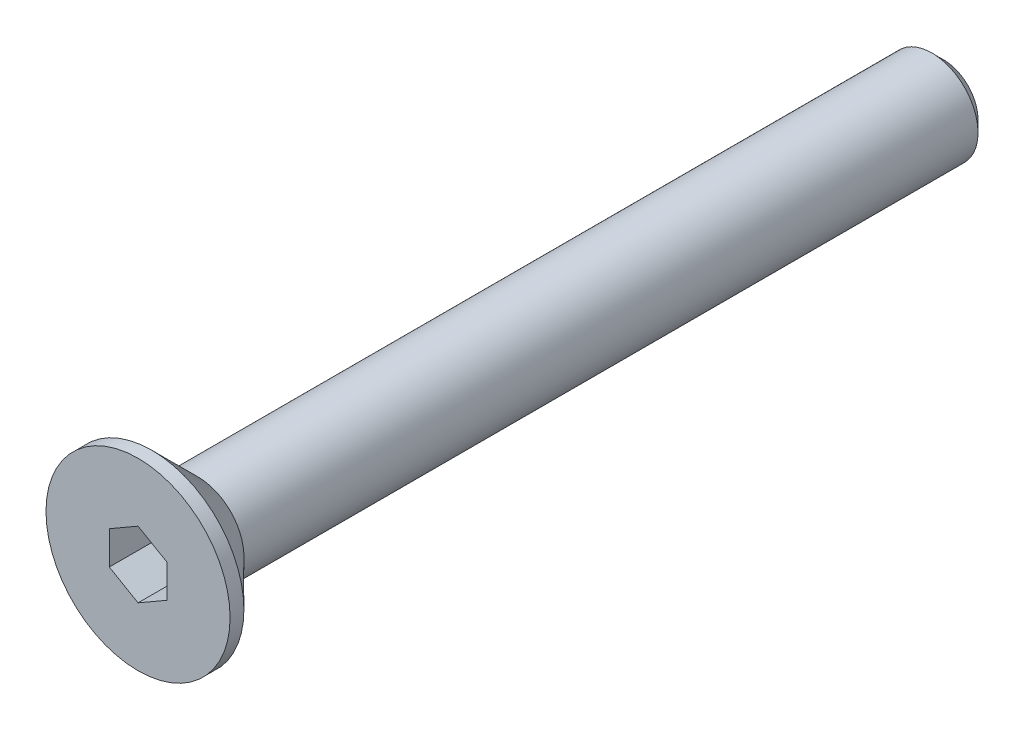
ISO-10303-21;
HEADER;
FILE_DESCRIPTION(('STEP AP214'),'2;1');
FILE_NAME('part.step','',(''),(''),'','','');
FILE_SCHEMA(('AUTOMOTIVE_DESIGN { 1 0 10303 214 1 1 1 1 }'));
ENDSEC;
DATA;
#1=APPLICATION_CONTEXT('core data for automotive mechanical design processes');
#2=APPLICATION_PROTOCOL_DEFINITION('international standard','automotive_design',2000,#1);
#3=PRODUCT_CONTEXT('',#1,'mechanical');
#4=PRODUCT('Part','Part','',(#3));
#5=PRODUCT_RELATED_PRODUCT_CATEGORY('part','',(#4));
#6=PRODUCT_DEFINITION_FORMATION('','',#4);
#7=PRODUCT_DEFINITION_CONTEXT('part definition',#1,'design');
#8=PRODUCT_DEFINITION('design','',#6,#7);
#9=PRODUCT_DEFINITION_SHAPE('','',#8);
#10=(LENGTH_UNIT() NAMED_UNIT(*) SI_UNIT(.MILLI.,.METRE.));
#11=(NAMED_UNIT(*) PLANE_ANGLE_UNIT() SI_UNIT($,.RADIAN.));
#12=(NAMED_UNIT(*) SI_UNIT($,.STERADIAN.) SOLID_ANGLE_UNIT());
#13=UNCERTAINTY_MEASURE_WITH_UNIT(LENGTH_MEASURE(1.E-05),#10,'distance_accuracy_value','');
#14=(GEOMETRIC_REPRESENTATION_CONTEXT(3) GLOBAL_UNCERTAINTY_ASSIGNED_CONTEXT((#13)) GLOBAL_UNIT_ASSIGNED_CONTEXT((#10,
#11,#12)) REPRESENTATION_CONTEXT('',''));
#15=CARTESIAN_POINT('',(0.,0.,0.));
#16=DIRECTION('',(0.,0.,1.));
#17=DIRECTION('',(1.,0.,0.));
#18=AXIS2_PLACEMENT_3D('',#15,#16,#17);
#19=CARTESIAN_POINT('',(0.,0.,17.5));
#20=DIRECTION('',(0.,0.,1.));
#21=DIRECTION('',(1.,0.,0.));
#22=AXIS2_PLACEMENT_3D('',#19,#20,#21);
#23=PLANE('',#22);
#24=DIRECTION('',(-0.866025403784439,0.5,0.));
#25=VECTOR('',#24,1.);
#26=CARTESIAN_POINT('',(1.25,0.721687836487034,17.5));
#27=LINE('',#26,#25);
#28=CARTESIAN_POINT('',(1.25,0.721687836487034,17.5));
#29=VERTEX_POINT('',#28);
#30=CARTESIAN_POINT('',(0.,1.44337567297407,17.5));
#31=VERTEX_POINT('',#30);
#32=EDGE_CURVE('E53',#29,#31,#27,.T.);
#33=ORIENTED_EDGE('',*,*,#32,.F.);
#34=DIRECTION('',(0.,1.,0.));
#35=VECTOR('',#34,1.);
#36=CARTESIAN_POINT('',(1.25,-0.721687836487031,17.5));
#37=LINE('',#36,#35);
#38=CARTESIAN_POINT('',(1.25,-0.721687836487031,17.5));
#39=VERTEX_POINT('',#38);
#40=EDGE_CURVE('E136',#39,#29,#37,.T.);
#41=ORIENTED_EDGE('',*,*,#40,.F.);
#42=DIRECTION('',(0.866025403784439,0.5,0.));
#43=VECTOR('',#42,1.);
#44=CARTESIAN_POINT('',(0.,-1.44337567297406,17.5));
#45=LINE('',#44,#43);
#46=CARTESIAN_POINT('',(0.,-1.44337567297406,17.5));
#47=VERTEX_POINT('',#46);
#48=EDGE_CURVE('E134',#47,#39,#45,.T.);
#49=ORIENTED_EDGE('',*,*,#48,.F.);
#50=DIRECTION('',(0.866025403784439,-0.5,0.));
#51=VECTOR('',#50,1.);
#52=CARTESIAN_POINT('',(-1.25,-0.721687836487031,17.5));
#53=LINE('',#52,#51);
#54=CARTESIAN_POINT('',(-1.25,-0.721687836487031,17.5));
#55=VERTEX_POINT('',#54);
#56=EDGE_CURVE('E101',#55,#47,#53,.T.);
#57=ORIENTED_EDGE('',*,*,#56,.F.);
#58=DIRECTION('',(0.,-1.,0.));
#59=VECTOR('',#58,1.);
#60=CARTESIAN_POINT('',(-1.25,0.721687836487034,17.5));
#61=LINE('',#60,#59);
#62=CARTESIAN_POINT('',(-1.25,0.721687836487034,17.5));
#63=VERTEX_POINT('',#62);
#64=EDGE_CURVE('E130',#63,#55,#61,.T.);
#65=ORIENTED_EDGE('',*,*,#64,.F.);
#66=DIRECTION('',(-0.866025403784439,-0.5,0.));
#67=VECTOR('',#66,1.);
#68=CARTESIAN_POINT('',(0.,1.44337567297407,17.5));
#69=LINE('',#68,#67);
#70=EDGE_CURVE('E127',#31,#63,#69,.T.);
#71=ORIENTED_EDGE('',*,*,#70,.F.);
#72=EDGE_LOOP('',(#33,#41,#49,#57,#65,#71));
#73=FACE_BOUND('',#72,.T.);
#74=CARTESIAN_POINT('',(0.,0.,17.5));
#75=DIRECTION('',(0.,0.,-1.));
#76=DIRECTION('',(-1.,0.,0.));
#77=AXIS2_PLACEMENT_3D('',#74,#75,#76);
#78=CIRCLE('',#77,4.);
#79=CARTESIAN_POINT('',(-4.,0.,17.5));
#80=VERTEX_POINT('',#79);
#81=EDGE_CURVE('E151',#80,#80,#78,.T.);
#82=ORIENTED_EDGE('',*,*,#81,.F.);
#83=EDGE_LOOP('',(#82));
#84=FACE_BOUND('',#83,.T.);
#85=ADVANCED_FACE('F37',(#73,#84),#23,.T.);
#86=CARTESIAN_POINT('',(0.,0.,-17.5));
#87=DIRECTION('',(0.,0.,-1.));
#88=DIRECTION('',(-1.,0.,0.));
#89=AXIS2_PLACEMENT_3D('',#86,#87,#88);
#90=CYLINDRICAL_SURFACE('',#89,4.);
#91=ORIENTED_EDGE('',*,*,#81,.T.);
#92=EDGE_LOOP('',(#91));
#93=FACE_BOUND('',#92,.T.);
#94=CARTESIAN_POINT('',(0.,0.,16.9));
#95=DIRECTION('',(0.,0.,-1.));
#96=DIRECTION('',(-1.,0.,0.));
#97=AXIS2_PLACEMENT_3D('',#94,#95,#96);
#98=CIRCLE('',#97,4.);
#99=CARTESIAN_POINT('',(-4.,0.,16.9));
#100=VERTEX_POINT('',#99);
#101=EDGE_CURVE('E148',#100,#100,#98,.T.);
#102=ORIENTED_EDGE('',*,*,#101,.F.);
#103=EDGE_LOOP('',(#102));
#104=FACE_BOUND('',#103,.T.);
#105=ADVANCED_FACE('F171',(#93,#104),#90,.T.);
#106=CARTESIAN_POINT('',(0.,0.,14.9));
#107=DIRECTION('',(0.,0.,1.));
#108=DIRECTION('',(1.,0.,0.));
#109=AXIS2_PLACEMENT_3D('',#106,#107,#108);
#110=CONICAL_SURFACE('',#109,2.,0.78539816339745);
#111=ORIENTED_EDGE('',*,*,#101,.T.);
#112=EDGE_LOOP('',(#111));
#113=FACE_BOUND('',#112,.T.);
#114=CARTESIAN_POINT('',(0.,0.,14.9));
#115=DIRECTION('',(0.,0.,-1.));
#116=DIRECTION('',(-1.,0.,0.));
#117=AXIS2_PLACEMENT_3D('',#114,#115,#116);
#118=CIRCLE('',#117,2.);
#119=CARTESIAN_POINT('',(-2.,0.,14.9));
#120=VERTEX_POINT('',#119);
#121=EDGE_CURVE('E140',#120,#120,#118,.T.);
#122=ORIENTED_EDGE('',*,*,#121,.F.);
#123=EDGE_LOOP('',(#122));
#124=FACE_BOUND('',#123,.T.);
#125=ADVANCED_FACE('F176',(#113,#124),#110,.T.);
#126=CARTESIAN_POINT('',(0.,0.,-17.5));
#127=DIRECTION('',(0.,0.,-1.));
#128=DIRECTION('',(-1.,0.,0.));
#129=AXIS2_PLACEMENT_3D('',#126,#127,#128);
#130=CYLINDRICAL_SURFACE('',#129,2.);
#131=CARTESIAN_POINT('',(0.,0.,-17.));
#132=DIRECTION('',(0.,0.,-1.));
#133=DIRECTION('',(-1.,0.,0.));
#134=AXIS2_PLACEMENT_3D('',#131,#132,#133);
#135=CIRCLE('',#134,2.);
#136=CARTESIAN_POINT('',(-2.,0.,-17.));
#137=VERTEX_POINT('',#136);
#138=EDGE_CURVE('E11',#137,#137,#135,.F.);
#139=ORIENTED_EDGE('',*,*,#138,.T.);
#140=EDGE_LOOP('',(#139));
#141=FACE_BOUND('',#140,.T.);
#142=ORIENTED_EDGE('',*,*,#121,.T.);
#143=EDGE_LOOP('',(#142));
#144=FACE_BOUND('',#143,.T.);
#145=ADVANCED_FACE('F167',(#141,#144),#130,.T.);
#146=CARTESIAN_POINT('',(0.,2.,-17.5));
#147=DIRECTION('',(0.,0.,-1.));
#148=DIRECTION('',(-1.,0.,0.));
#149=AXIS2_PLACEMENT_3D('',#146,#147,#148);
#150=PLANE('',#149);
#151=CARTESIAN_POINT('',(0.,0.,-17.5));
#152=DIRECTION('',(0.,0.,-1.));
#153=DIRECTION('',(-1.,0.,0.));
#154=AXIS2_PLACEMENT_3D('',#151,#152,#153);
#155=CIRCLE('',#154,1.49999999999999);
#156=CARTESIAN_POINT('',(-1.49999999999999,0.,-17.5));
#157=VERTEX_POINT('',#156);
#158=EDGE_CURVE('E46',#157,#157,#155,.T.);
#159=ORIENTED_EDGE('',*,*,#158,.T.);
#160=EDGE_LOOP('',(#159));
#161=FACE_BOUND('',#160,.T.);
#162=ADVANCED_FACE('F156',(#161),#150,.T.);
#163=CARTESIAN_POINT('',(0.,0.,-17.5));
#164=DIRECTION('',(0.,0.,1.));
#165=DIRECTION('',(1.,0.,0.));
#166=AXIS2_PLACEMENT_3D('',#163,#164,#165);
#167=CONICAL_SURFACE('',#166,1.49999999999999,0.785398163397448);
#168=ORIENTED_EDGE('',*,*,#138,.F.);
#169=EDGE_LOOP('',(#168));
#170=FACE_BOUND('',#169,.T.);
#171=ORIENTED_EDGE('',*,*,#158,.F.);
#172=EDGE_LOOP('',(#171));
#173=FACE_BOUND('',#172,.T.);
#174=ADVANCED_FACE('F40',(#170,#173),#167,.T.);
#175=CARTESIAN_POINT('',(1.25,0.721687836487034,15.));
#176=DIRECTION('',(0.5,0.866025403784439,0.));
#177=DIRECTION('',(-0.866025403784439,0.5,0.));
#178=AXIS2_PLACEMENT_3D('',#175,#176,#177);
#179=PLANE('',#178);
#180=ORIENTED_EDGE('',*,*,#32,.T.);
#181=DIRECTION('',(0.,0.,1.));
#182=VECTOR('',#181,1.);
#183=CARTESIAN_POINT('',(0.,1.44337567297407,15.));
#184=LINE('',#183,#182);
#185=CARTESIAN_POINT('',(0.,1.44337567297407,15.));
#186=VERTEX_POINT('',#185);
#187=EDGE_CURVE('E83',#186,#31,#184,.T.);
#188=ORIENTED_EDGE('',*,*,#187,.F.);
#189=DIRECTION('',(-0.866025403784439,0.5,0.));
#190=VECTOR('',#189,1.);
#191=CARTESIAN_POINT('',(1.25,0.721687836487034,15.));
#192=LINE('',#191,#190);
#193=CARTESIAN_POINT('',(1.25,0.721687836487034,15.));
#194=VERTEX_POINT('',#193);
#195=EDGE_CURVE('E138',#194,#186,#192,.T.);
#196=ORIENTED_EDGE('',*,*,#195,.F.);
#197=DIRECTION('',(0.,0.,1.));
#198=VECTOR('',#197,1.);
#199=CARTESIAN_POINT('',(1.25,0.721687836487034,15.));
#200=LINE('',#199,#198);
#201=EDGE_CURVE('E61',#194,#29,#200,.T.);
#202=ORIENTED_EDGE('',*,*,#201,.T.);
#203=EDGE_LOOP('',(#180,#188,#196,#202));
#204=FACE_BOUND('',#203,.T.);
#205=ADVANCED_FACE('F159',(#204),#179,.F.);
#206=CARTESIAN_POINT('',(1.25,-0.721687836487031,15.));
#207=DIRECTION('',(1.,0.,0.));
#208=DIRECTION('',(0.,1.,0.));
#209=AXIS2_PLACEMENT_3D('',#206,#207,#208);
#210=PLANE('',#209);
#211=ORIENTED_EDGE('',*,*,#40,.T.);
#212=ORIENTED_EDGE('',*,*,#201,.F.);
#213=DIRECTION('',(0.,1.,0.));
#214=VECTOR('',#213,1.);
#215=CARTESIAN_POINT('',(1.25,-0.721687836487031,15.));
#216=LINE('',#215,#214);
#217=CARTESIAN_POINT('',(1.25,-0.721687836487031,15.));
#218=VERTEX_POINT('',#217);
#219=EDGE_CURVE('E113',#218,#194,#216,.T.);
#220=ORIENTED_EDGE('',*,*,#219,.F.);
#221=DIRECTION('',(0.,0.,1.));
#222=VECTOR('',#221,1.);
#223=CARTESIAN_POINT('',(1.25,-0.721687836487031,15.));
#224=LINE('',#223,#222);
#225=EDGE_CURVE('E105',#218,#39,#224,.T.);
#226=ORIENTED_EDGE('',*,*,#225,.T.);
#227=EDGE_LOOP('',(#211,#212,#220,#226));
#228=FACE_BOUND('',#227,.T.);
#229=ADVANCED_FACE('F165',(#228),#210,.F.);
#230=CARTESIAN_POINT('',(0.,-1.44337567297406,15.));
#231=DIRECTION('',(0.5,-0.866025403784439,0.));
#232=DIRECTION('',(0.866025403784439,0.5,0.));
#233=AXIS2_PLACEMENT_3D('',#230,#231,#232);
#234=PLANE('',#233);
#235=ORIENTED_EDGE('',*,*,#48,.T.);
#236=ORIENTED_EDGE('',*,*,#225,.F.);
#237=DIRECTION('',(0.866025403784439,0.5,0.));
#238=VECTOR('',#237,1.);
#239=CARTESIAN_POINT('',(0.,-1.44337567297406,15.));
#240=LINE('',#239,#238);
#241=CARTESIAN_POINT('',(0.,-1.44337567297406,15.));
#242=VERTEX_POINT('',#241);
#243=EDGE_CURVE('E109',#242,#218,#240,.T.);
#244=ORIENTED_EDGE('',*,*,#243,.F.);
#245=DIRECTION('',(0.,0.,1.));
#246=VECTOR('',#245,1.);
#247=CARTESIAN_POINT('',(0.,-1.44337567297406,15.));
#248=LINE('',#247,#246);
#249=EDGE_CURVE('E94',#242,#47,#248,.T.);
#250=ORIENTED_EDGE('',*,*,#249,.T.);
#251=EDGE_LOOP('',(#235,#236,#244,#250));
#252=FACE_BOUND('',#251,.T.);
#253=ADVANCED_FACE('F110',(#252),#234,.F.);
#254=CARTESIAN_POINT('',(-1.25,-0.721687836487031,15.));
#255=DIRECTION('',(-0.5,-0.866025403784438,0.));
#256=DIRECTION('',(0.866025403784439,-0.5,0.));
#257=AXIS2_PLACEMENT_3D('',#254,#255,#256);
#258=PLANE('',#257);
#259=ORIENTED_EDGE('',*,*,#56,.T.);
#260=ORIENTED_EDGE('',*,*,#249,.F.);
#261=DIRECTION('',(0.866025403784439,-0.5,0.));
#262=VECTOR('',#261,1.);
#263=CARTESIAN_POINT('',(-1.25,-0.721687836487031,15.));
#264=LINE('',#263,#262);
#265=CARTESIAN_POINT('',(-1.25,-0.721687836487031,15.));
#266=VERTEX_POINT('',#265);
#267=EDGE_CURVE('E98',#266,#242,#264,.T.);
#268=ORIENTED_EDGE('',*,*,#267,.F.);
#269=DIRECTION('',(0.,0.,1.));
#270=VECTOR('',#269,1.);
#271=CARTESIAN_POINT('',(-1.25,-0.721687836487031,15.));
#272=LINE('',#271,#270);
#273=EDGE_CURVE('E106',#266,#55,#272,.T.);
#274=ORIENTED_EDGE('',*,*,#273,.T.);
#275=EDGE_LOOP('',(#259,#260,#268,#274));
#276=FACE_BOUND('',#275,.T.);
#277=ADVANCED_FACE('F96',(#276),#258,.F.);
#278=CARTESIAN_POINT('',(-1.25,0.721687836487034,15.));
#279=DIRECTION('',(-1.,0.,0.));
#280=DIRECTION('',(0.,0.,1.));
#281=AXIS2_PLACEMENT_3D('',#278,#279,#280);
#282=PLANE('',#281);
#283=ORIENTED_EDGE('',*,*,#64,.T.);
#284=ORIENTED_EDGE('',*,*,#273,.F.);
#285=DIRECTION('',(0.,-1.,0.));
#286=VECTOR('',#285,1.);
#287=CARTESIAN_POINT('',(-1.25,0.721687836487034,15.));
#288=LINE('',#287,#286);
#289=CARTESIAN_POINT('',(-1.25,0.721687836487034,15.));
#290=VERTEX_POINT('',#289);
#291=EDGE_CURVE('E119',#290,#266,#288,.T.);
#292=ORIENTED_EDGE('',*,*,#291,.F.);
#293=DIRECTION('',(0.,0.,1.));
#294=VECTOR('',#293,1.);
#295=CARTESIAN_POINT('',(-1.25,0.721687836487034,15.));
#296=LINE('',#295,#294);
#297=EDGE_CURVE('E143',#290,#63,#296,.T.);
#298=ORIENTED_EDGE('',*,*,#297,.T.);
#299=EDGE_LOOP('',(#283,#284,#292,#298));
#300=FACE_BOUND('',#299,.T.);
#301=ADVANCED_FACE('F190',(#300),#282,.F.);
#302=CARTESIAN_POINT('',(0.,1.44337567297407,15.));
#303=DIRECTION('',(-0.5,0.866025403784439,0.));
#304=DIRECTION('',(-0.866025403784439,-0.5,0.));
#305=AXIS2_PLACEMENT_3D('',#302,#303,#304);
#306=PLANE('',#305);
#307=ORIENTED_EDGE('',*,*,#70,.T.);
#308=ORIENTED_EDGE('',*,*,#297,.F.);
#309=DIRECTION('',(-0.866025403784439,-0.5,0.));
#310=VECTOR('',#309,1.);
#311=CARTESIAN_POINT('',(0.,1.44337567297407,15.));
#312=LINE('',#311,#310);
#313=EDGE_CURVE('E121',#186,#290,#312,.T.);
#314=ORIENTED_EDGE('',*,*,#313,.F.);
#315=ORIENTED_EDGE('',*,*,#187,.T.);
#316=EDGE_LOOP('',(#307,#308,#314,#315));
#317=FACE_BOUND('',#316,.T.);
#318=ADVANCED_FACE('F187',(#317),#306,.F.);
#319=CARTESIAN_POINT('',(0.,0.,15.));
#320=DIRECTION('',(0.,0.,1.));
#321=DIRECTION('',(1.,0.,0.));
#322=AXIS2_PLACEMENT_3D('',#319,#320,#321);
#323=PLANE('',#322);
#324=ORIENTED_EDGE('',*,*,#195,.T.);
#325=ORIENTED_EDGE('',*,*,#313,.T.);
#326=ORIENTED_EDGE('',*,*,#291,.T.);
#327=ORIENTED_EDGE('',*,*,#267,.T.);
#328=ORIENTED_EDGE('',*,*,#243,.T.);
#329=ORIENTED_EDGE('',*,*,#219,.T.);
#330=EDGE_LOOP('',(#324,#325,#326,#327,#328,#329));
#331=FACE_BOUND('',#330,.T.);
#332=ADVANCED_FACE('F116',(#331),#323,.T.);
#333=CLOSED_SHELL('',(#85,#105,#125,#145,#162,#174,#205,#229,#253,#277,#301,#318,#332));
#334=MANIFOLD_SOLID_BREP('B2',#333);
#335=ADVANCED_BREP_SHAPE_REPRESENTATION('',(#18,#334),#14);
#336=SHAPE_DEFINITION_REPRESENTATION(#9,#335);
ENDSEC;
END-ISO-10303-21;
